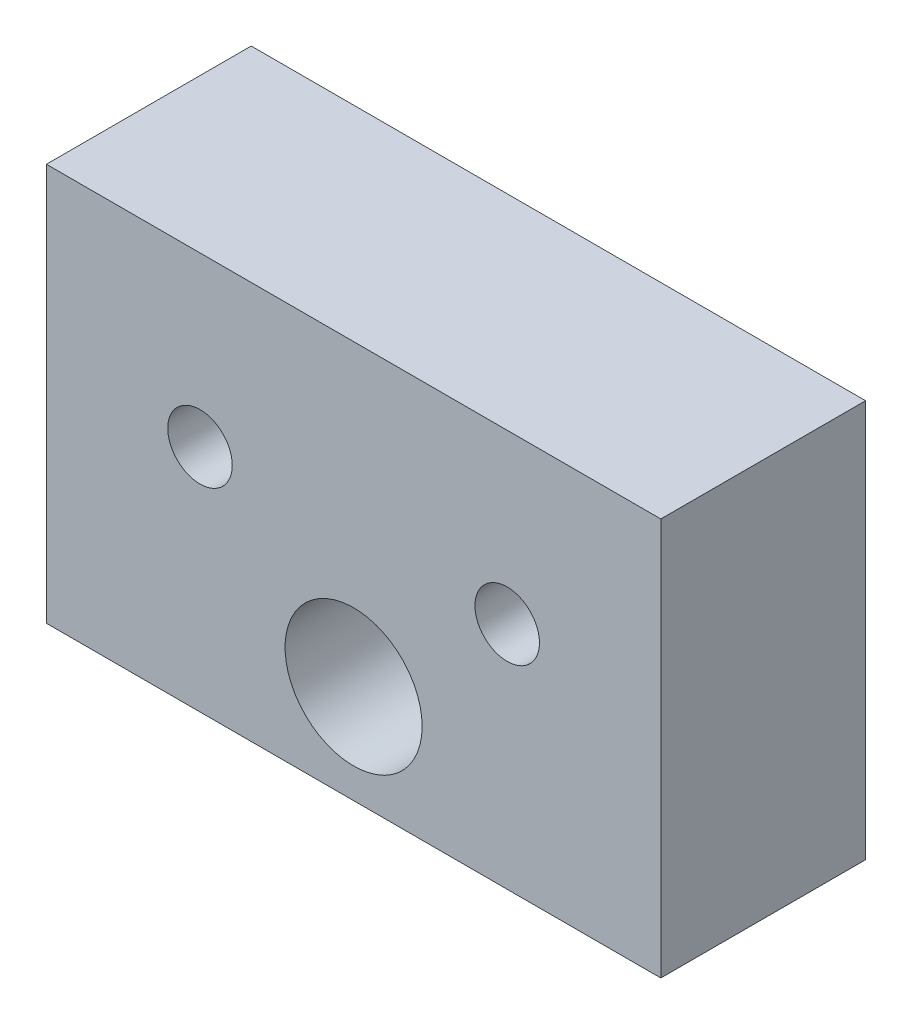
ISO-10303-21;
HEADER;
FILE_DESCRIPTION(('STEP AP214'),'2;1');
FILE_NAME('part.step','',(''),(''),'','','');
FILE_SCHEMA(('AUTOMOTIVE_DESIGN { 1 0 10303 214 1 1 1 1 }'));
ENDSEC;
DATA;
#1=APPLICATION_CONTEXT('core data for automotive mechanical design processes');
#2=APPLICATION_PROTOCOL_DEFINITION('international standard','automotive_design',2000,#1);
#3=PRODUCT_CONTEXT('',#1,'mechanical');
#4=PRODUCT('Part','Part','',(#3));
#5=PRODUCT_RELATED_PRODUCT_CATEGORY('part','',(#4));
#6=PRODUCT_DEFINITION_FORMATION('','',#4);
#7=PRODUCT_DEFINITION_CONTEXT('part definition',#1,'design');
#8=PRODUCT_DEFINITION('design','',#6,#7);
#9=PRODUCT_DEFINITION_SHAPE('','',#8);
#10=(LENGTH_UNIT() NAMED_UNIT(*) SI_UNIT(.MILLI.,.METRE.));
#11=(NAMED_UNIT(*) PLANE_ANGLE_UNIT() SI_UNIT($,.RADIAN.));
#12=(NAMED_UNIT(*) SI_UNIT($,.STERADIAN.) SOLID_ANGLE_UNIT());
#13=UNCERTAINTY_MEASURE_WITH_UNIT(LENGTH_MEASURE(1.E-05),#10,'distance_accuracy_value','');
#14=(GEOMETRIC_REPRESENTATION_CONTEXT(3) GLOBAL_UNCERTAINTY_ASSIGNED_CONTEXT((#13)) GLOBAL_UNIT_ASSIGNED_CONTEXT((#10,
#11,#12)) REPRESENTATION_CONTEXT('',''));
#15=CARTESIAN_POINT('',(0.,0.,0.));
#16=DIRECTION('',(0.,0.,1.));
#17=DIRECTION('',(1.,0.,0.));
#18=AXIS2_PLACEMENT_3D('',#15,#16,#17);
#19=CARTESIAN_POINT('',(0.,37.084,12.7));
#20=DIRECTION('',(0.,1.,0.));
#21=DIRECTION('',(0.,0.,1.));
#22=AXIS2_PLACEMENT_3D('',#19,#20,#21);
#23=PLANE('',#22);
#24=DIRECTION('',(1.,0.,0.));
#25=VECTOR('',#24,1.);
#26=CARTESIAN_POINT('',(0.,37.084,-12.7));
#27=LINE('',#26,#25);
#28=CARTESIAN_POINT('',(-38.1,37.084,-12.7));
#29=VERTEX_POINT('',#28);
#30=CARTESIAN_POINT('',(38.1,37.084,-12.7));
#31=VERTEX_POINT('',#30);
#32=EDGE_CURVE('E105',#29,#31,#27,.T.);
#33=ORIENTED_EDGE('',*,*,#32,.F.);
#34=DIRECTION('',(0.,0.,-1.));
#35=VECTOR('',#34,1.);
#36=CARTESIAN_POINT('',(-38.1,37.084,12.7));
#37=LINE('',#36,#35);
#38=CARTESIAN_POINT('',(-38.1,37.084,12.7));
#39=VERTEX_POINT('',#38);
#40=EDGE_CURVE('E11',#39,#29,#37,.T.);
#41=ORIENTED_EDGE('',*,*,#40,.F.);
#42=DIRECTION('',(1.,0.,0.));
#43=VECTOR('',#42,1.);
#44=CARTESIAN_POINT('',(0.,37.084,12.7));
#45=LINE('',#44,#43);
#46=CARTESIAN_POINT('',(38.1,37.084,12.7));
#47=VERTEX_POINT('',#46);
#48=EDGE_CURVE('E91',#39,#47,#45,.T.);
#49=ORIENTED_EDGE('',*,*,#48,.T.);
#50=DIRECTION('',(0.,0.,-1.));
#51=VECTOR('',#50,1.);
#52=CARTESIAN_POINT('',(38.1,37.084,12.7));
#53=LINE('',#52,#51);
#54=EDGE_CURVE('E73',#47,#31,#53,.T.);
#55=ORIENTED_EDGE('',*,*,#54,.T.);
#56=EDGE_LOOP('',(#33,#41,#49,#55));
#57=FACE_BOUND('',#56,.T.);
#58=ADVANCED_FACE('F34',(#57),#23,.T.);
#59=CARTESIAN_POINT('',(-38.1,0.,12.7));
#60=DIRECTION('',(1.,0.,0.));
#61=DIRECTION('',(0.,0.,-1.));
#62=AXIS2_PLACEMENT_3D('',#59,#60,#61);
#63=PLANE('',#62);
#64=DIRECTION('',(0.,-1.,0.));
#65=VECTOR('',#64,1.);
#66=CARTESIAN_POINT('',(-38.1,0.,-12.7));
#67=LINE('',#66,#65);
#68=CARTESIAN_POINT('',(-38.1,-12.224,-12.7));
#69=VERTEX_POINT('',#68);
#70=EDGE_CURVE('E96',#29,#69,#67,.T.);
#71=ORIENTED_EDGE('',*,*,#70,.T.);
#72=DIRECTION('',(0.,0.,-1.));
#73=VECTOR('',#72,1.);
#74=CARTESIAN_POINT('',(-38.1,-12.224,12.7));
#75=LINE('',#74,#73);
#76=CARTESIAN_POINT('',(-38.1,-12.224,12.7));
#77=VERTEX_POINT('',#76);
#78=EDGE_CURVE('E43',#77,#69,#75,.T.);
#79=ORIENTED_EDGE('',*,*,#78,.F.);
#80=DIRECTION('',(0.,-1.,0.));
#81=VECTOR('',#80,1.);
#82=CARTESIAN_POINT('',(-38.1,0.,12.7));
#83=LINE('',#82,#81);
#84=EDGE_CURVE('E88',#39,#77,#83,.T.);
#85=ORIENTED_EDGE('',*,*,#84,.F.);
#86=ORIENTED_EDGE('',*,*,#40,.T.);
#87=EDGE_LOOP('',(#71,#79,#85,#86));
#88=FACE_BOUND('',#87,.T.);
#89=ADVANCED_FACE('F94',(#88),#63,.F.);
#90=CARTESIAN_POINT('',(0.,-12.224,12.7));
#91=DIRECTION('',(0.,1.,0.));
#92=DIRECTION('',(0.,0.,1.));
#93=AXIS2_PLACEMENT_3D('',#90,#91,#92);
#94=PLANE('',#93);
#95=DIRECTION('',(1.,0.,0.));
#96=VECTOR('',#95,1.);
#97=CARTESIAN_POINT('',(0.,-12.224,-12.7));
#98=LINE('',#97,#96);
#99=CARTESIAN_POINT('',(38.1,-12.224,-12.7));
#100=VERTEX_POINT('',#99);
#101=EDGE_CURVE('E102',#69,#100,#98,.T.);
#102=ORIENTED_EDGE('',*,*,#101,.T.);
#103=DIRECTION('',(0.,0.,-1.));
#104=VECTOR('',#103,1.);
#105=CARTESIAN_POINT('',(38.1,-12.224,12.7));
#106=LINE('',#105,#104);
#107=CARTESIAN_POINT('',(38.1,-12.224,12.7));
#108=VERTEX_POINT('',#107);
#109=EDGE_CURVE('E87',#108,#100,#106,.T.);
#110=ORIENTED_EDGE('',*,*,#109,.F.);
#111=DIRECTION('',(1.,0.,0.));
#112=VECTOR('',#111,1.);
#113=CARTESIAN_POINT('',(0.,-12.224,12.7));
#114=LINE('',#113,#112);
#115=EDGE_CURVE('E81',#77,#108,#114,.T.);
#116=ORIENTED_EDGE('',*,*,#115,.F.);
#117=ORIENTED_EDGE('',*,*,#78,.T.);
#118=EDGE_LOOP('',(#102,#110,#116,#117));
#119=FACE_BOUND('',#118,.T.);
#120=ADVANCED_FACE('F84',(#119),#94,.F.);
#121=CARTESIAN_POINT('',(0.,0.,12.7));
#122=DIRECTION('',(0.,0.,-1.));
#123=DIRECTION('',(-1.,0.,0.));
#124=AXIS2_PLACEMENT_3D('',#121,#122,#123);
#125=CYLINDRICAL_SURFACE('',#124,8.5);
#126=CARTESIAN_POINT('',(0.,0.,12.7));
#127=DIRECTION('',(0.,0.,1.));
#128=DIRECTION('',(1.,0.,0.));
#129=AXIS2_PLACEMENT_3D('',#126,#127,#128);
#130=CIRCLE('',#129,8.5);
#131=CARTESIAN_POINT('',(8.5,0.,12.7));
#132=VERTEX_POINT('',#131);
#133=EDGE_CURVE('E118',#132,#132,#130,.T.);
#134=ORIENTED_EDGE('',*,*,#133,.T.);
#135=EDGE_LOOP('',(#134));
#136=FACE_BOUND('',#135,.T.);
#137=CARTESIAN_POINT('',(0.,0.,-12.7));
#138=DIRECTION('',(0.,0.,1.));
#139=DIRECTION('',(1.,0.,0.));
#140=AXIS2_PLACEMENT_3D('',#137,#138,#139);
#141=CIRCLE('',#140,8.5);
#142=CARTESIAN_POINT('',(8.5,0.,-12.7));
#143=VERTEX_POINT('',#142);
#144=EDGE_CURVE('E107',#143,#143,#141,.T.);
#145=ORIENTED_EDGE('',*,*,#144,.F.);
#146=EDGE_LOOP('',(#145));
#147=FACE_BOUND('',#146,.T.);
#148=ADVANCED_FACE('F138',(#136,#147),#125,.F.);
#149=CARTESIAN_POINT('',(19.05,16.256,12.7));
#150=DIRECTION('',(0.,0.,-1.));
#151=DIRECTION('',(-1.,0.,0.));
#152=AXIS2_PLACEMENT_3D('',#149,#150,#151);
#153=CYLINDRICAL_SURFACE('',#152,4.);
#154=CARTESIAN_POINT('',(19.05,16.256,12.7));
#155=DIRECTION('',(0.,0.,1.));
#156=DIRECTION('',(1.,0.,0.));
#157=AXIS2_PLACEMENT_3D('',#154,#155,#156);
#158=CIRCLE('',#157,4.);
#159=CARTESIAN_POINT('',(23.05,16.256,12.7));
#160=VERTEX_POINT('',#159);
#161=EDGE_CURVE('E121',#160,#160,#158,.T.);
#162=ORIENTED_EDGE('',*,*,#161,.T.);
#163=EDGE_LOOP('',(#162));
#164=FACE_BOUND('',#163,.T.);
#165=CARTESIAN_POINT('',(19.05,16.256,-12.7));
#166=DIRECTION('',(0.,0.,1.));
#167=DIRECTION('',(1.,0.,0.));
#168=AXIS2_PLACEMENT_3D('',#165,#166,#167);
#169=CIRCLE('',#168,4.);
#170=CARTESIAN_POINT('',(23.05,16.256,-12.7));
#171=VERTEX_POINT('',#170);
#172=EDGE_CURVE('E110',#171,#171,#169,.T.);
#173=ORIENTED_EDGE('',*,*,#172,.F.);
#174=EDGE_LOOP('',(#173));
#175=FACE_BOUND('',#174,.T.);
#176=ADVANCED_FACE('F141',(#164,#175),#153,.F.);
#177=CARTESIAN_POINT('',(-19.05,16.256,12.7));
#178=DIRECTION('',(0.,0.,-1.));
#179=DIRECTION('',(-1.,0.,0.));
#180=AXIS2_PLACEMENT_3D('',#177,#178,#179);
#181=CYLINDRICAL_SURFACE('',#180,4.);
#182=CARTESIAN_POINT('',(-19.05,16.256,12.7));
#183=DIRECTION('',(0.,0.,1.));
#184=DIRECTION('',(1.,0.,0.));
#185=AXIS2_PLACEMENT_3D('',#182,#183,#184);
#186=CIRCLE('',#185,4.);
#187=CARTESIAN_POINT('',(-15.05,16.256,12.7));
#188=VERTEX_POINT('',#187);
#189=EDGE_CURVE('E101',#188,#188,#186,.T.);
#190=ORIENTED_EDGE('',*,*,#189,.T.);
#191=EDGE_LOOP('',(#190));
#192=FACE_BOUND('',#191,.T.);
#193=CARTESIAN_POINT('',(-19.05,16.256,-12.7));
#194=DIRECTION('',(0.,0.,1.));
#195=DIRECTION('',(1.,0.,0.));
#196=AXIS2_PLACEMENT_3D('',#193,#194,#195);
#197=CIRCLE('',#196,4.);
#198=CARTESIAN_POINT('',(-15.05,16.256,-12.7));
#199=VERTEX_POINT('',#198);
#200=EDGE_CURVE('E113',#199,#199,#197,.T.);
#201=ORIENTED_EDGE('',*,*,#200,.F.);
#202=EDGE_LOOP('',(#201));
#203=FACE_BOUND('',#202,.T.);
#204=ADVANCED_FACE('F36',(#192,#203),#181,.F.);
#205=CARTESIAN_POINT('',(38.1,0.,12.7));
#206=DIRECTION('',(-1.,0.,0.));
#207=DIRECTION('',(0.,0.,1.));
#208=AXIS2_PLACEMENT_3D('',#205,#206,#207);
#209=PLANE('',#208);
#210=DIRECTION('',(0.,1.,0.));
#211=VECTOR('',#210,1.);
#212=CARTESIAN_POINT('',(38.1,0.,-12.7));
#213=LINE('',#212,#211);
#214=EDGE_CURVE('E66',#100,#31,#213,.T.);
#215=ORIENTED_EDGE('',*,*,#214,.T.);
#216=ORIENTED_EDGE('',*,*,#54,.F.);
#217=DIRECTION('',(0.,1.,0.));
#218=VECTOR('',#217,1.);
#219=CARTESIAN_POINT('',(38.1,0.,12.7));
#220=LINE('',#219,#218);
#221=EDGE_CURVE('E51',#108,#47,#220,.T.);
#222=ORIENTED_EDGE('',*,*,#221,.F.);
#223=ORIENTED_EDGE('',*,*,#109,.T.);
#224=EDGE_LOOP('',(#215,#216,#222,#223));
#225=FACE_BOUND('',#224,.T.);
#226=ADVANCED_FACE('F132',(#225),#209,.F.);
#227=CARTESIAN_POINT('',(0.,0.,12.7));
#228=DIRECTION('',(0.,0.,1.));
#229=DIRECTION('',(1.,0.,0.));
#230=AXIS2_PLACEMENT_3D('',#227,#228,#229);
#231=PLANE('',#230);
#232=ORIENTED_EDGE('',*,*,#189,.F.);
#233=EDGE_LOOP('',(#232));
#234=FACE_BOUND('',#233,.T.);
#235=ORIENTED_EDGE('',*,*,#161,.F.);
#236=EDGE_LOOP('',(#235));
#237=FACE_BOUND('',#236,.T.);
#238=ORIENTED_EDGE('',*,*,#133,.F.);
#239=EDGE_LOOP('',(#238));
#240=FACE_BOUND('',#239,.T.);
#241=ORIENTED_EDGE('',*,*,#48,.F.);
#242=ORIENTED_EDGE('',*,*,#84,.T.);
#243=ORIENTED_EDGE('',*,*,#115,.T.);
#244=ORIENTED_EDGE('',*,*,#221,.T.);
#245=EDGE_LOOP('',(#241,#242,#243,#244));
#246=FACE_BOUND('',#245,.T.);
#247=ADVANCED_FACE('F90',(#234,#237,#240,#246),#231,.T.);
#248=CARTESIAN_POINT('',(0.,0.,-12.7));
#249=DIRECTION('',(0.,0.,1.));
#250=DIRECTION('',(1.,0.,0.));
#251=AXIS2_PLACEMENT_3D('',#248,#249,#250);
#252=PLANE('',#251);
#253=ORIENTED_EDGE('',*,*,#200,.T.);
#254=EDGE_LOOP('',(#253));
#255=FACE_BOUND('',#254,.T.);
#256=ORIENTED_EDGE('',*,*,#172,.T.);
#257=EDGE_LOOP('',(#256));
#258=FACE_BOUND('',#257,.T.);
#259=ORIENTED_EDGE('',*,*,#144,.T.);
#260=EDGE_LOOP('',(#259));
#261=FACE_BOUND('',#260,.T.);
#262=ORIENTED_EDGE('',*,*,#32,.T.);
#263=ORIENTED_EDGE('',*,*,#214,.F.);
#264=ORIENTED_EDGE('',*,*,#101,.F.);
#265=ORIENTED_EDGE('',*,*,#70,.F.);
#266=EDGE_LOOP('',(#262,#263,#264,#265));
#267=FACE_BOUND('',#266,.T.);
#268=ADVANCED_FACE('F131',(#255,#258,#261,#267),#252,.F.);
#269=CLOSED_SHELL('',(#58,#89,#120,#148,#176,#204,#226,#247,#268));
#270=MANIFOLD_SOLID_BREP('B2',#269);
#271=ADVANCED_BREP_SHAPE_REPRESENTATION('',(#18,#270),#14);
#272=SHAPE_DEFINITION_REPRESENTATION(#9,#271);
ENDSEC;
END-ISO-10303-21;
